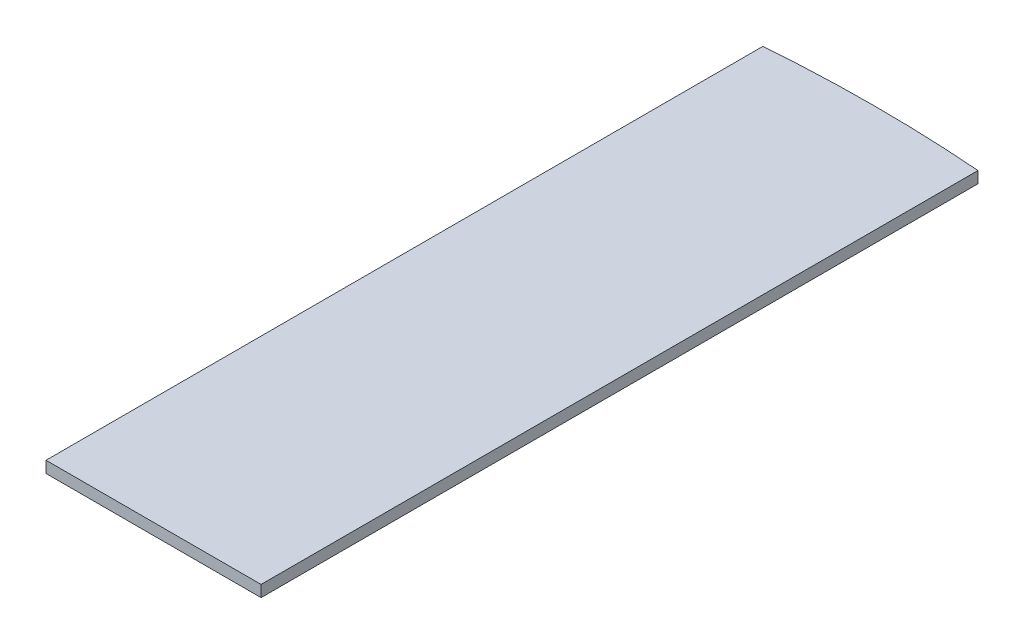
ISO-10303-21;
HEADER;
FILE_DESCRIPTION(('STEP AP214'),'2;1');
FILE_NAME('part.step','',(''),(''),'','','');
FILE_SCHEMA(('AUTOMOTIVE_DESIGN { 1 0 10303 214 1 1 1 1 }'));
ENDSEC;
DATA;
#1=APPLICATION_CONTEXT('core data for automotive mechanical design processes');
#2=APPLICATION_PROTOCOL_DEFINITION('international standard','automotive_design',2000,#1);
#3=PRODUCT_CONTEXT('',#1,'mechanical');
#4=PRODUCT('Part','Part','',(#3));
#5=PRODUCT_RELATED_PRODUCT_CATEGORY('part','',(#4));
#6=PRODUCT_DEFINITION_FORMATION('','',#4);
#7=PRODUCT_DEFINITION_CONTEXT('part definition',#1,'design');
#8=PRODUCT_DEFINITION('design','',#6,#7);
#9=PRODUCT_DEFINITION_SHAPE('','',#8);
#10=(LENGTH_UNIT() NAMED_UNIT(*) SI_UNIT(.MILLI.,.METRE.));
#11=(NAMED_UNIT(*) PLANE_ANGLE_UNIT() SI_UNIT($,.RADIAN.));
#12=(NAMED_UNIT(*) SI_UNIT($,.STERADIAN.) SOLID_ANGLE_UNIT());
#13=UNCERTAINTY_MEASURE_WITH_UNIT(LENGTH_MEASURE(1.E-05),#10,'distance_accuracy_value','');
#14=(GEOMETRIC_REPRESENTATION_CONTEXT(3) GLOBAL_UNCERTAINTY_ASSIGNED_CONTEXT((#13)) GLOBAL_UNIT_ASSIGNED_CONTEXT((#10,
#11,#12)) REPRESENTATION_CONTEXT('',''));
#15=CARTESIAN_POINT('',(0.,0.,0.));
#16=DIRECTION('',(0.,0.,1.));
#17=DIRECTION('',(1.,0.,0.));
#18=AXIS2_PLACEMENT_3D('',#15,#16,#17);
#19=CARTESIAN_POINT('',(0.,-8.,0.));
#20=DIRECTION('',(0.,1.,0.));
#21=DIRECTION('',(0.,0.,1.));
#22=AXIS2_PLACEMENT_3D('',#19,#20,#21);
#23=CYLINDRICAL_SURFACE('',#22,969.5);
#24=CARTESIAN_POINT('',(0.,0.,0.));
#25=DIRECTION('',(0.,1.,0.));
#26=DIRECTION('',(0.,0.,-1.));
#27=AXIS2_PLACEMENT_3D('',#24,#25,#26);
#28=CIRCLE('',#27,969.5);
#29=CARTESIAN_POINT('',(75.,0.,-966.594666858865));
#30=VERTEX_POINT('',#29);
#31=CARTESIAN_POINT('',(-75.,0.,-966.594666858865));
#32=VERTEX_POINT('',#31);
#33=EDGE_CURVE('E100',#30,#32,#28,.T.);
#34=ORIENTED_EDGE('',*,*,#33,.F.);
#35=DIRECTION('',(0.,1.,0.));
#36=VECTOR('',#35,1.);
#37=CARTESIAN_POINT('',(75.,-8.,-966.594666858865));
#38=LINE('',#37,#36);
#39=CARTESIAN_POINT('',(75.,-8.,-966.594666858865));
#40=VERTEX_POINT('',#39);
#41=EDGE_CURVE('E11',#40,#30,#38,.T.);
#42=ORIENTED_EDGE('',*,*,#41,.F.);
#43=CARTESIAN_POINT('',(0.,-8.,0.));
#44=DIRECTION('',(0.,1.,0.));
#45=DIRECTION('',(0.,0.,-1.));
#46=AXIS2_PLACEMENT_3D('',#43,#44,#45);
#47=CIRCLE('',#46,969.5);
#48=CARTESIAN_POINT('',(-75.,-8.,-966.594666858865));
#49=VERTEX_POINT('',#48);
#50=EDGE_CURVE('E94',#40,#49,#47,.T.);
#51=ORIENTED_EDGE('',*,*,#50,.T.);
#52=DIRECTION('',(0.,1.,0.));
#53=VECTOR('',#52,1.);
#54=CARTESIAN_POINT('',(-75.,-8.,-966.594666858865));
#55=LINE('',#54,#53);
#56=EDGE_CURVE('E39',#49,#32,#55,.T.);
#57=ORIENTED_EDGE('',*,*,#56,.T.);
#58=EDGE_LOOP('',(#34,#42,#51,#57));
#59=FACE_BOUND('',#58,.T.);
#60=ADVANCED_FACE('F36',(#59),#23,.T.);
#61=CARTESIAN_POINT('',(75.,-8.,-466.594666858865));
#62=DIRECTION('',(1.,0.,0.));
#63=DIRECTION('',(0.,0.,-1.));
#64=AXIS2_PLACEMENT_3D('',#61,#62,#63);
#65=PLANE('',#64);
#66=DIRECTION('',(0.,0.,-1.));
#67=VECTOR('',#66,1.);
#68=CARTESIAN_POINT('',(75.,0.,-466.594666858865));
#69=LINE('',#68,#67);
#70=CARTESIAN_POINT('',(75.,0.,-466.594666858865));
#71=VERTEX_POINT('',#70);
#72=EDGE_CURVE('E96',#71,#30,#69,.T.);
#73=ORIENTED_EDGE('',*,*,#72,.F.);
#74=DIRECTION('',(0.,1.,0.));
#75=VECTOR('',#74,1.);
#76=CARTESIAN_POINT('',(75.,-8.,-466.594666858865));
#77=LINE('',#76,#75);
#78=CARTESIAN_POINT('',(75.,-8.,-466.594666858865));
#79=VERTEX_POINT('',#78);
#80=EDGE_CURVE('E45',#79,#71,#77,.T.);
#81=ORIENTED_EDGE('',*,*,#80,.F.);
#82=DIRECTION('',(0.,0.,-1.));
#83=VECTOR('',#82,1.);
#84=CARTESIAN_POINT('',(75.,-8.,-466.594666858865));
#85=LINE('',#84,#83);
#86=EDGE_CURVE('E91',#79,#40,#85,.T.);
#87=ORIENTED_EDGE('',*,*,#86,.T.);
#88=ORIENTED_EDGE('',*,*,#41,.T.);
#89=EDGE_LOOP('',(#73,#81,#87,#88));
#90=FACE_BOUND('',#89,.T.);
#91=ADVANCED_FACE('F110',(#90),#65,.T.);
#92=CARTESIAN_POINT('',(-75.,-8.,-466.594666858865));
#93=DIRECTION('',(0.,0.,1.));
#94=DIRECTION('',(1.,0.,0.));
#95=AXIS2_PLACEMENT_3D('',#92,#93,#94);
#96=PLANE('',#95);
#97=DIRECTION('',(1.,0.,0.));
#98=VECTOR('',#97,1.);
#99=CARTESIAN_POINT('',(-75.,0.,-466.594666858865));
#100=LINE('',#99,#98);
#101=CARTESIAN_POINT('',(-75.,0.,-466.594666858865));
#102=VERTEX_POINT('',#101);
#103=EDGE_CURVE('E86',#102,#71,#100,.T.);
#104=ORIENTED_EDGE('',*,*,#103,.F.);
#105=DIRECTION('',(0.,1.,0.));
#106=VECTOR('',#105,1.);
#107=CARTESIAN_POINT('',(-75.,-8.,-466.594666858865));
#108=LINE('',#107,#106);
#109=CARTESIAN_POINT('',(-75.,-8.,-466.594666858865));
#110=VERTEX_POINT('',#109);
#111=EDGE_CURVE('E81',#110,#102,#108,.T.);
#112=ORIENTED_EDGE('',*,*,#111,.F.);
#113=DIRECTION('',(1.,0.,0.));
#114=VECTOR('',#113,1.);
#115=CARTESIAN_POINT('',(-75.,-8.,-466.594666858865));
#116=LINE('',#115,#114);
#117=EDGE_CURVE('E84',#110,#79,#116,.T.);
#118=ORIENTED_EDGE('',*,*,#117,.T.);
#119=ORIENTED_EDGE('',*,*,#80,.T.);
#120=EDGE_LOOP('',(#104,#112,#118,#119));
#121=FACE_BOUND('',#120,.T.);
#122=ADVANCED_FACE('F83',(#121),#96,.T.);
#123=CARTESIAN_POINT('',(-75.,-8.,-966.594666858865));
#124=DIRECTION('',(-1.,0.,0.));
#125=DIRECTION('',(0.,0.,1.));
#126=AXIS2_PLACEMENT_3D('',#123,#124,#125);
#127=PLANE('',#126);
#128=DIRECTION('',(0.,0.,1.));
#129=VECTOR('',#128,1.);
#130=CARTESIAN_POINT('',(-75.,0.,-966.594666858865));
#131=LINE('',#130,#129);
#132=EDGE_CURVE('E103',#32,#102,#131,.T.);
#133=ORIENTED_EDGE('',*,*,#132,.F.);
#134=ORIENTED_EDGE('',*,*,#56,.F.);
#135=DIRECTION('',(0.,0.,1.));
#136=VECTOR('',#135,1.);
#137=CARTESIAN_POINT('',(-75.,-8.,-966.594666858865));
#138=LINE('',#137,#136);
#139=EDGE_CURVE('E90',#49,#110,#138,.T.);
#140=ORIENTED_EDGE('',*,*,#139,.T.);
#141=ORIENTED_EDGE('',*,*,#111,.T.);
#142=EDGE_LOOP('',(#133,#134,#140,#141));
#143=FACE_BOUND('',#142,.T.);
#144=ADVANCED_FACE('F93',(#143),#127,.T.);
#145=CARTESIAN_POINT('',(0.,-8.,0.));
#146=DIRECTION('',(0.,-1.,0.));
#147=DIRECTION('',(0.,0.,-1.));
#148=AXIS2_PLACEMENT_3D('',#145,#146,#147);
#149=PLANE('',#148);
#150=ORIENTED_EDGE('',*,*,#50,.F.);
#151=ORIENTED_EDGE('',*,*,#86,.F.);
#152=ORIENTED_EDGE('',*,*,#117,.F.);
#153=ORIENTED_EDGE('',*,*,#139,.F.);
#154=EDGE_LOOP('',(#150,#151,#152,#153));
#155=FACE_BOUND('',#154,.T.);
#156=ADVANCED_FACE('F89',(#155),#149,.T.);
#157=CARTESIAN_POINT('',(0.,0.,0.));
#158=DIRECTION('',(0.,-1.,0.));
#159=DIRECTION('',(0.,0.,-1.));
#160=AXIS2_PLACEMENT_3D('',#157,#158,#159);
#161=PLANE('',#160);
#162=ORIENTED_EDGE('',*,*,#33,.T.);
#163=ORIENTED_EDGE('',*,*,#132,.T.);
#164=ORIENTED_EDGE('',*,*,#103,.T.);
#165=ORIENTED_EDGE('',*,*,#72,.T.);
#166=EDGE_LOOP('',(#162,#163,#164,#165));
#167=FACE_BOUND('',#166,.T.);
#168=ADVANCED_FACE('F109',(#167),#161,.F.);
#169=CLOSED_SHELL('',(#60,#91,#122,#144,#156,#168));
#170=MANIFOLD_SOLID_BREP('B2',#169);
#171=ADVANCED_BREP_SHAPE_REPRESENTATION('',(#18,#170),#14);
#172=SHAPE_DEFINITION_REPRESENTATION(#9,#171);
ENDSEC;
END-ISO-10303-21;
